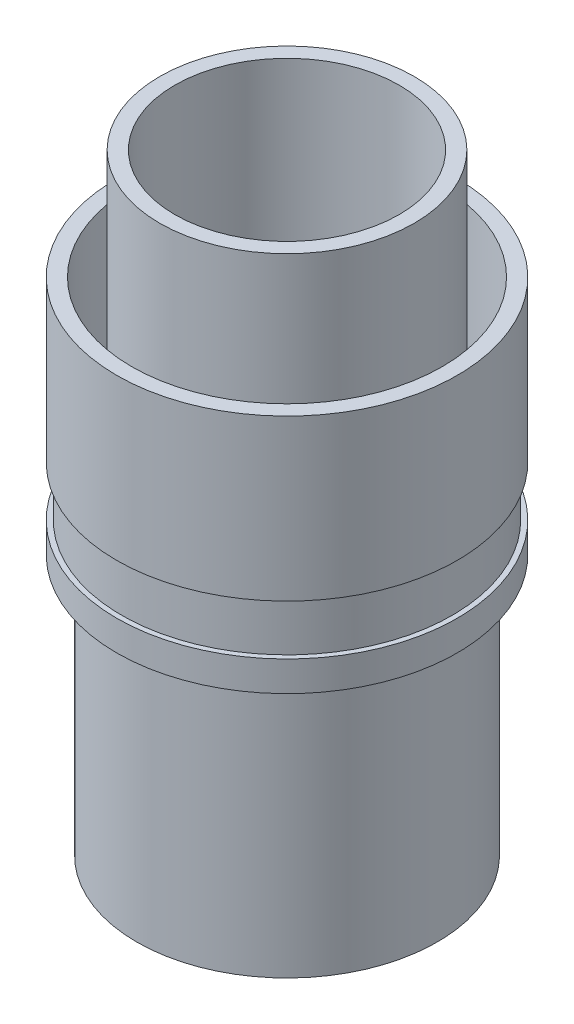
ISO-10303-21;
HEADER;
FILE_DESCRIPTION(('STEP AP214'),'2;1');
FILE_NAME('part.step','',(''),(''),'','','');
FILE_SCHEMA(('AUTOMOTIVE_DESIGN { 1 0 10303 214 1 1 1 1 }'));
ENDSEC;
DATA;
#1=APPLICATION_CONTEXT('core data for automotive mechanical design processes');
#2=APPLICATION_PROTOCOL_DEFINITION('international standard','automotive_design',2000,#1);
#3=PRODUCT_CONTEXT('',#1,'mechanical');
#4=PRODUCT('Part','Part','',(#3));
#5=PRODUCT_RELATED_PRODUCT_CATEGORY('part','',(#4));
#6=PRODUCT_DEFINITION_FORMATION('','',#4);
#7=PRODUCT_DEFINITION_CONTEXT('part definition',#1,'design');
#8=PRODUCT_DEFINITION('design','',#6,#7);
#9=PRODUCT_DEFINITION_SHAPE('','',#8);
#10=(LENGTH_UNIT() NAMED_UNIT(*) SI_UNIT(.MILLI.,.METRE.));
#11=(NAMED_UNIT(*) PLANE_ANGLE_UNIT() SI_UNIT($,.RADIAN.));
#12=(NAMED_UNIT(*) SI_UNIT($,.STERADIAN.) SOLID_ANGLE_UNIT());
#13=UNCERTAINTY_MEASURE_WITH_UNIT(LENGTH_MEASURE(1.E-05),#10,'distance_accuracy_value','');
#14=(GEOMETRIC_REPRESENTATION_CONTEXT(3) GLOBAL_UNCERTAINTY_ASSIGNED_CONTEXT((#13)) GLOBAL_UNIT_ASSIGNED_CONTEXT((#10,
#11,#12)) REPRESENTATION_CONTEXT('',''));
#15=CARTESIAN_POINT('',(0.,0.,0.));
#16=DIRECTION('',(0.,0.,1.));
#17=DIRECTION('',(1.,0.,0.));
#18=AXIS2_PLACEMENT_3D('',#15,#16,#17);
#19=CARTESIAN_POINT('',(-20.9122410546139,-5.43691148775896,0.));
#20=DIRECTION('',(0.,-1.,0.));
#21=DIRECTION('',(0.,0.,-1.));
#22=AXIS2_PLACEMENT_3D('',#19,#20,#21);
#23=CYLINDRICAL_SURFACE('',#22,16.5);
#24=CARTESIAN_POINT('',(-20.9122410546139,28.563088512241,0.));
#25=DIRECTION('',(0.,-1.,0.));
#26=DIRECTION('',(0.,0.,-1.));
#27=AXIS2_PLACEMENT_3D('',#24,#25,#26);
#28=CIRCLE('',#27,16.5);
#29=CARTESIAN_POINT('',(-20.9122410546139,28.563088512241,-16.5));
#30=VERTEX_POINT('',#29);
#31=EDGE_CURVE('E68',#30,#30,#28,.T.);
#32=ORIENTED_EDGE('',*,*,#31,.T.);
#33=EDGE_LOOP('',(#32));
#34=FACE_BOUND('',#33,.T.);
#35=CARTESIAN_POINT('',(-20.9122410546139,23.563088512241,0.));
#36=DIRECTION('',(0.,-1.,0.));
#37=DIRECTION('',(0.,0.,-1.));
#38=AXIS2_PLACEMENT_3D('',#35,#36,#37);
#39=CIRCLE('',#38,16.5);
#40=CARTESIAN_POINT('',(-20.9122410546139,23.563088512241,-16.5));
#41=VERTEX_POINT('',#40);
#42=EDGE_CURVE('E71',#41,#41,#39,.T.);
#43=ORIENTED_EDGE('',*,*,#42,.F.);
#44=EDGE_LOOP('',(#43));
#45=FACE_BOUND('',#44,.T.);
#46=ADVANCED_FACE('F39',(#34,#45),#23,.T.);
#47=CARTESIAN_POINT('',(0.,23.563088512241,0.));
#48=DIRECTION('',(0.,1.,0.));
#49=DIRECTION('',(0.,0.,1.));
#50=AXIS2_PLACEMENT_3D('',#47,#48,#49);
#51=PLANE('',#50);
#52=ORIENTED_EDGE('',*,*,#42,.T.);
#53=EDGE_LOOP('',(#52));
#54=FACE_BOUND('',#53,.T.);
#55=CARTESIAN_POINT('',(-20.9122410546139,23.563088512241,0.));
#56=DIRECTION('',(0.,-1.,0.));
#57=DIRECTION('',(0.,0.,-1.));
#58=AXIS2_PLACEMENT_3D('',#55,#56,#57);
#59=CIRCLE('',#58,17.);
#60=CARTESIAN_POINT('',(-20.9122410546139,23.563088512241,-17.));
#61=VERTEX_POINT('',#60);
#62=EDGE_CURVE('E11',#61,#61,#59,.T.);
#63=ORIENTED_EDGE('',*,*,#62,.F.);
#64=EDGE_LOOP('',(#63));
#65=FACE_BOUND('',#64,.T.);
#66=ADVANCED_FACE('F41',(#54,#65),#51,.T.);
#67=CARTESIAN_POINT('',(0.,28.563088512241,0.));
#68=DIRECTION('',(0.,-1.,0.));
#69=DIRECTION('',(0.,0.,-1.));
#70=AXIS2_PLACEMENT_3D('',#67,#68,#69);
#71=PLANE('',#70);
#72=CARTESIAN_POINT('',(-20.9122410546139,28.563088512241,0.));
#73=DIRECTION('',(0.,-1.,0.));
#74=DIRECTION('',(0.,0.,-1.));
#75=AXIS2_PLACEMENT_3D('',#72,#73,#74);
#76=CIRCLE('',#75,17.);
#77=CARTESIAN_POINT('',(-20.9122410546139,28.563088512241,-17.));
#78=VERTEX_POINT('',#77);
#79=EDGE_CURVE('E65',#78,#78,#76,.T.);
#80=ORIENTED_EDGE('',*,*,#79,.T.);
#81=EDGE_LOOP('',(#80));
#82=FACE_BOUND('',#81,.T.);
#83=ORIENTED_EDGE('',*,*,#31,.F.);
#84=EDGE_LOOP('',(#83));
#85=FACE_BOUND('',#84,.T.);
#86=ADVANCED_FACE('F131',(#82,#85),#71,.T.);
#87=CARTESIAN_POINT('',(-20.9122410546139,-5.43691148775896,0.));
#88=DIRECTION('',(0.,-1.,0.));
#89=DIRECTION('',(0.,0.,-1.));
#90=AXIS2_PLACEMENT_3D('',#87,#88,#89);
#91=CYLINDRICAL_SURFACE('',#90,17.);
#92=ORIENTED_EDGE('',*,*,#79,.F.);
#93=EDGE_LOOP('',(#92));
#94=FACE_BOUND('',#93,.T.);
#95=CARTESIAN_POINT('',(-20.9122410546139,44.563088512241,0.));
#96=DIRECTION('',(0.,-1.,0.));
#97=DIRECTION('',(0.,0.,-1.));
#98=AXIS2_PLACEMENT_3D('',#95,#96,#97);
#99=CIRCLE('',#98,17.);
#100=CARTESIAN_POINT('',(-20.9122410546139,44.563088512241,-17.));
#101=VERTEX_POINT('',#100);
#102=EDGE_CURVE('E62',#101,#101,#99,.T.);
#103=ORIENTED_EDGE('',*,*,#102,.T.);
#104=EDGE_LOOP('',(#103));
#105=FACE_BOUND('',#104,.T.);
#106=ADVANCED_FACE('F137',(#94,#105),#91,.T.);
#107=CARTESIAN_POINT('',(0.,44.563088512241,0.));
#108=DIRECTION('',(0.,-1.,0.));
#109=DIRECTION('',(0.,0.,-1.));
#110=AXIS2_PLACEMENT_3D('',#107,#108,#109);
#111=PLANE('',#110);
#112=CARTESIAN_POINT('',(-20.9122410546139,44.563088512241,0.));
#113=DIRECTION('',(0.,-1.,0.));
#114=DIRECTION('',(0.,0.,-1.));
#115=AXIS2_PLACEMENT_3D('',#112,#113,#114);
#116=CIRCLE('',#115,15.5);
#117=CARTESIAN_POINT('',(-20.9122410546139,44.563088512241,-15.5));
#118=VERTEX_POINT('',#117);
#119=EDGE_CURVE('E43',#118,#118,#116,.T.);
#120=ORIENTED_EDGE('',*,*,#119,.T.);
#121=EDGE_LOOP('',(#120));
#122=FACE_BOUND('',#121,.T.);
#123=ORIENTED_EDGE('',*,*,#102,.F.);
#124=EDGE_LOOP('',(#123));
#125=FACE_BOUND('',#124,.T.);
#126=ADVANCED_FACE('F112',(#122,#125),#111,.F.);
#127=CARTESIAN_POINT('',(-20.9122410546139,-5.43691148775896,0.));
#128=DIRECTION('',(0.,-1.,0.));
#129=DIRECTION('',(0.,0.,-1.));
#130=AXIS2_PLACEMENT_3D('',#127,#128,#129);
#131=CYLINDRICAL_SURFACE('',#130,15.);
#132=CARTESIAN_POINT('',(-20.9122410546139,-5.43691148775896,0.));
#133=DIRECTION('',(0.,-1.,0.));
#134=DIRECTION('',(0.,0.,-1.));
#135=AXIS2_PLACEMENT_3D('',#132,#133,#134);
#136=CIRCLE('',#135,15.);
#137=CARTESIAN_POINT('',(-20.9122410546139,-5.43691148775896,-15.));
#138=VERTEX_POINT('',#137);
#139=EDGE_CURVE('E56',#138,#138,#136,.T.);
#140=ORIENTED_EDGE('',*,*,#139,.F.);
#141=EDGE_LOOP('',(#140));
#142=FACE_BOUND('',#141,.T.);
#143=CARTESIAN_POINT('',(-20.9122410546139,20.563088512241,0.));
#144=DIRECTION('',(0.,-1.,0.));
#145=DIRECTION('',(0.,0.,-1.));
#146=AXIS2_PLACEMENT_3D('',#143,#144,#145);
#147=CIRCLE('',#146,15.);
#148=CARTESIAN_POINT('',(-20.9122410546139,20.563088512241,-15.));
#149=VERTEX_POINT('',#148);
#150=EDGE_CURVE('E51',#149,#149,#147,.T.);
#151=ORIENTED_EDGE('',*,*,#150,.T.);
#152=EDGE_LOOP('',(#151));
#153=FACE_BOUND('',#152,.T.);
#154=ADVANCED_FACE('F106',(#142,#153),#131,.T.);
#155=CARTESIAN_POINT('',(0.,-5.43691148775896,0.));
#156=DIRECTION('',(0.,1.,0.));
#157=DIRECTION('',(0.,0.,1.));
#158=AXIS2_PLACEMENT_3D('',#155,#156,#157);
#159=PLANE('',#158);
#160=CARTESIAN_POINT('',(-20.9122410546139,-5.43691148775896,0.));
#161=DIRECTION('',(0.,-1.,0.));
#162=DIRECTION('',(0.,0.,-1.));
#163=AXIS2_PLACEMENT_3D('',#160,#161,#162);
#164=CIRCLE('',#163,13.5);
#165=CARTESIAN_POINT('',(-20.9122410546139,-5.43691148775896,-13.5));
#166=VERTEX_POINT('',#165);
#167=EDGE_CURVE('E87',#166,#166,#164,.T.);
#168=ORIENTED_EDGE('',*,*,#167,.F.);
#169=EDGE_LOOP('',(#168));
#170=FACE_BOUND('',#169,.T.);
#171=ORIENTED_EDGE('',*,*,#139,.T.);
#172=EDGE_LOOP('',(#171));
#173=FACE_BOUND('',#172,.T.);
#174=ADVANCED_FACE('F102',(#170,#173),#159,.F.);
#175=CARTESIAN_POINT('',(0.,20.563088512241,0.));
#176=DIRECTION('',(0.,1.,0.));
#177=DIRECTION('',(0.,0.,1.));
#178=AXIS2_PLACEMENT_3D('',#175,#176,#177);
#179=PLANE('',#178);
#180=ORIENTED_EDGE('',*,*,#150,.F.);
#181=EDGE_LOOP('',(#180));
#182=FACE_BOUND('',#181,.T.);
#183=CARTESIAN_POINT('',(-20.9122410546139,20.563088512241,0.));
#184=DIRECTION('',(0.,-1.,0.));
#185=DIRECTION('',(0.,0.,-1.));
#186=AXIS2_PLACEMENT_3D('',#183,#184,#185);
#187=CIRCLE('',#186,17.);
#188=CARTESIAN_POINT('',(-20.9122410546139,20.563088512241,-17.));
#189=VERTEX_POINT('',#188);
#190=EDGE_CURVE('E47',#189,#189,#187,.T.);
#191=ORIENTED_EDGE('',*,*,#190,.T.);
#192=EDGE_LOOP('',(#191));
#193=FACE_BOUND('',#192,.T.);
#194=ADVANCED_FACE('F105',(#182,#193),#179,.F.);
#195=CARTESIAN_POINT('',(-20.9122410546139,-5.43691148775896,0.));
#196=DIRECTION('',(0.,-1.,0.));
#197=DIRECTION('',(0.,0.,-1.));
#198=AXIS2_PLACEMENT_3D('',#195,#196,#197);
#199=CYLINDRICAL_SURFACE('',#198,17.);
#200=ORIENTED_EDGE('',*,*,#190,.F.);
#201=EDGE_LOOP('',(#200));
#202=FACE_BOUND('',#201,.T.);
#203=ORIENTED_EDGE('',*,*,#62,.T.);
#204=EDGE_LOOP('',(#203));
#205=FACE_BOUND('',#204,.T.);
#206=ADVANCED_FACE('F118',(#202,#205),#199,.T.);
#207=CARTESIAN_POINT('',(-20.9122410546139,25.563088512241,0.));
#208=DIRECTION('',(0.,1.,0.));
#209=DIRECTION('',(0.,0.,1.));
#210=AXIS2_PLACEMENT_3D('',#207,#208,#209);
#211=CYLINDRICAL_SURFACE('',#210,15.5);
#212=CARTESIAN_POINT('',(-20.9122410546139,25.563088512241,0.));
#213=DIRECTION('',(0.,1.,0.));
#214=DIRECTION('',(0.,0.,1.));
#215=AXIS2_PLACEMENT_3D('',#212,#213,#214);
#216=CIRCLE('',#215,15.5);
#217=CARTESIAN_POINT('',(-20.9122410546139,25.563088512241,15.5));
#218=VERTEX_POINT('',#217);
#219=EDGE_CURVE('E78',#218,#218,#216,.T.);
#220=ORIENTED_EDGE('',*,*,#219,.F.);
#221=EDGE_LOOP('',(#220));
#222=FACE_BOUND('',#221,.T.);
#223=ORIENTED_EDGE('',*,*,#119,.F.);
#224=EDGE_LOOP('',(#223));
#225=FACE_BOUND('',#224,.T.);
#226=ADVANCED_FACE('F123',(#222,#225),#211,.F.);
#227=CARTESIAN_POINT('',(0.,25.563088512241,0.));
#228=DIRECTION('',(0.,1.,0.));
#229=DIRECTION('',(0.,0.,1.));
#230=AXIS2_PLACEMENT_3D('',#227,#228,#229);
#231=PLANE('',#230);
#232=CARTESIAN_POINT('',(-20.9122410546139,25.563088512241,0.));
#233=DIRECTION('',(0.,1.,0.));
#234=DIRECTION('',(0.,0.,1.));
#235=AXIS2_PLACEMENT_3D('',#232,#233,#234);
#236=CIRCLE('',#235,12.7);
#237=CARTESIAN_POINT('',(-20.9122410546139,25.563088512241,12.7));
#238=VERTEX_POINT('',#237);
#239=EDGE_CURVE('E83',#238,#238,#236,.T.);
#240=ORIENTED_EDGE('',*,*,#239,.F.);
#241=EDGE_LOOP('',(#240));
#242=FACE_BOUND('',#241,.T.);
#243=ORIENTED_EDGE('',*,*,#219,.T.);
#244=EDGE_LOOP('',(#243));
#245=FACE_BOUND('',#244,.T.);
#246=ADVANCED_FACE('F127',(#242,#245),#231,.T.);
#247=CARTESIAN_POINT('',(0.,55.563088512241,0.));
#248=DIRECTION('',(0.,-1.,0.));
#249=DIRECTION('',(0.,0.,-1.));
#250=AXIS2_PLACEMENT_3D('',#247,#248,#249);
#251=PLANE('',#250);
#252=CARTESIAN_POINT('',(-20.9122410546139,55.563088512241,0.));
#253=DIRECTION('',(0.,1.,0.));
#254=DIRECTION('',(0.,0.,1.));
#255=AXIS2_PLACEMENT_3D('',#252,#253,#254);
#256=CIRCLE('',#255,11.2);
#257=CARTESIAN_POINT('',(-20.9122410546139,55.563088512241,11.2));
#258=VERTEX_POINT('',#257);
#259=EDGE_CURVE('E74',#258,#258,#256,.T.);
#260=ORIENTED_EDGE('',*,*,#259,.F.);
#261=EDGE_LOOP('',(#260));
#262=FACE_BOUND('',#261,.T.);
#263=CARTESIAN_POINT('',(-20.9122410546139,55.563088512241,0.));
#264=DIRECTION('',(0.,-1.,0.));
#265=DIRECTION('',(0.,0.,-1.));
#266=AXIS2_PLACEMENT_3D('',#263,#264,#265);
#267=CIRCLE('',#266,12.7);
#268=CARTESIAN_POINT('',(-20.9122410546139,55.563088512241,-12.7));
#269=VERTEX_POINT('',#268);
#270=EDGE_CURVE('E59',#269,#269,#267,.T.);
#271=ORIENTED_EDGE('',*,*,#270,.F.);
#272=EDGE_LOOP('',(#271));
#273=FACE_BOUND('',#272,.T.);
#274=ADVANCED_FACE('F160',(#262,#273),#251,.F.);
#275=CARTESIAN_POINT('',(-20.9122410546139,-5.43691148775896,0.));
#276=DIRECTION('',(0.,-1.,0.));
#277=DIRECTION('',(0.,0.,-1.));
#278=AXIS2_PLACEMENT_3D('',#275,#276,#277);
#279=CYLINDRICAL_SURFACE('',#278,12.7);
#280=ORIENTED_EDGE('',*,*,#270,.T.);
#281=EDGE_LOOP('',(#280));
#282=FACE_BOUND('',#281,.T.);
#283=ORIENTED_EDGE('',*,*,#239,.T.);
#284=EDGE_LOOP('',(#283));
#285=FACE_BOUND('',#284,.T.);
#286=ADVANCED_FACE('F157',(#282,#285),#279,.T.);
#287=CARTESIAN_POINT('',(-20.9122410546139,25.563088512241,0.));
#288=DIRECTION('',(0.,1.,0.));
#289=DIRECTION('',(0.,0.,1.));
#290=AXIS2_PLACEMENT_3D('',#287,#288,#289);
#291=CYLINDRICAL_SURFACE('',#290,11.2);
#292=CARTESIAN_POINT('',(-20.9122410546139,25.563088512241,0.));
#293=DIRECTION('',(0.,1.,0.));
#294=DIRECTION('',(0.,0.,1.));
#295=AXIS2_PLACEMENT_3D('',#292,#293,#294);
#296=CIRCLE('',#295,11.2);
#297=CARTESIAN_POINT('',(-20.9122410546139,25.563088512241,11.2));
#298=VERTEX_POINT('',#297);
#299=EDGE_CURVE('E77',#298,#298,#296,.T.);
#300=ORIENTED_EDGE('',*,*,#299,.F.);
#301=EDGE_LOOP('',(#300));
#302=FACE_BOUND('',#301,.T.);
#303=ORIENTED_EDGE('',*,*,#259,.T.);
#304=EDGE_LOOP('',(#303));
#305=FACE_BOUND('',#304,.T.);
#306=ADVANCED_FACE('F148',(#302,#305),#291,.F.);
#307=CARTESIAN_POINT('',(0.,25.563088512241,0.));
#308=DIRECTION('',(0.,1.,0.));
#309=DIRECTION('',(0.,0.,1.));
#310=AXIS2_PLACEMENT_3D('',#307,#308,#309);
#311=PLANE('',#310);
#312=ORIENTED_EDGE('',*,*,#299,.T.);
#313=EDGE_LOOP('',(#312));
#314=FACE_BOUND('',#313,.T.);
#315=ADVANCED_FACE('F98',(#314),#311,.T.);
#316=CARTESIAN_POINT('',(-20.9122410546139,24.563088512241,0.));
#317=DIRECTION('',(0.,-1.,0.));
#318=DIRECTION('',(0.,0.,-1.));
#319=AXIS2_PLACEMENT_3D('',#316,#317,#318);
#320=CYLINDRICAL_SURFACE('',#319,13.5);
#321=CARTESIAN_POINT('',(-20.9122410546139,24.563088512241,0.));
#322=DIRECTION('',(0.,-1.,0.));
#323=DIRECTION('',(0.,0.,-1.));
#324=AXIS2_PLACEMENT_3D('',#321,#322,#323);
#325=CIRCLE('',#324,13.5);
#326=CARTESIAN_POINT('',(-20.9122410546139,24.563088512241,-13.5));
#327=VERTEX_POINT('',#326);
#328=EDGE_CURVE('E86',#327,#327,#325,.T.);
#329=ORIENTED_EDGE('',*,*,#328,.F.);
#330=EDGE_LOOP('',(#329));
#331=FACE_BOUND('',#330,.T.);
#332=ORIENTED_EDGE('',*,*,#167,.T.);
#333=EDGE_LOOP('',(#332));
#334=FACE_BOUND('',#333,.T.);
#335=ADVANCED_FACE('F95',(#331,#334),#320,.F.);
#336=CARTESIAN_POINT('',(-20.9122410546139,24.563088512241,0.));
#337=DIRECTION('',(0.,-1.,0.));
#338=DIRECTION('',(0.,0.,-1.));
#339=AXIS2_PLACEMENT_3D('',#336,#337,#338);
#340=PLANE('',#339);
#341=ORIENTED_EDGE('',*,*,#328,.T.);
#342=EDGE_LOOP('',(#341));
#343=FACE_BOUND('',#342,.T.);
#344=ADVANCED_FACE('F93',(#343),#340,.T.);
#345=CLOSED_SHELL('',(#46,#66,#86,#106,#126,#154,#174,#194,#206,#226,#246,#274,#286,#306,#315,
#335,#344));
#346=MANIFOLD_SOLID_BREP('B2',#345);
#347=ADVANCED_BREP_SHAPE_REPRESENTATION('',(#18,#346),#14);
#348=SHAPE_DEFINITION_REPRESENTATION(#9,#347);
ENDSEC;
END-ISO-10303-21;
